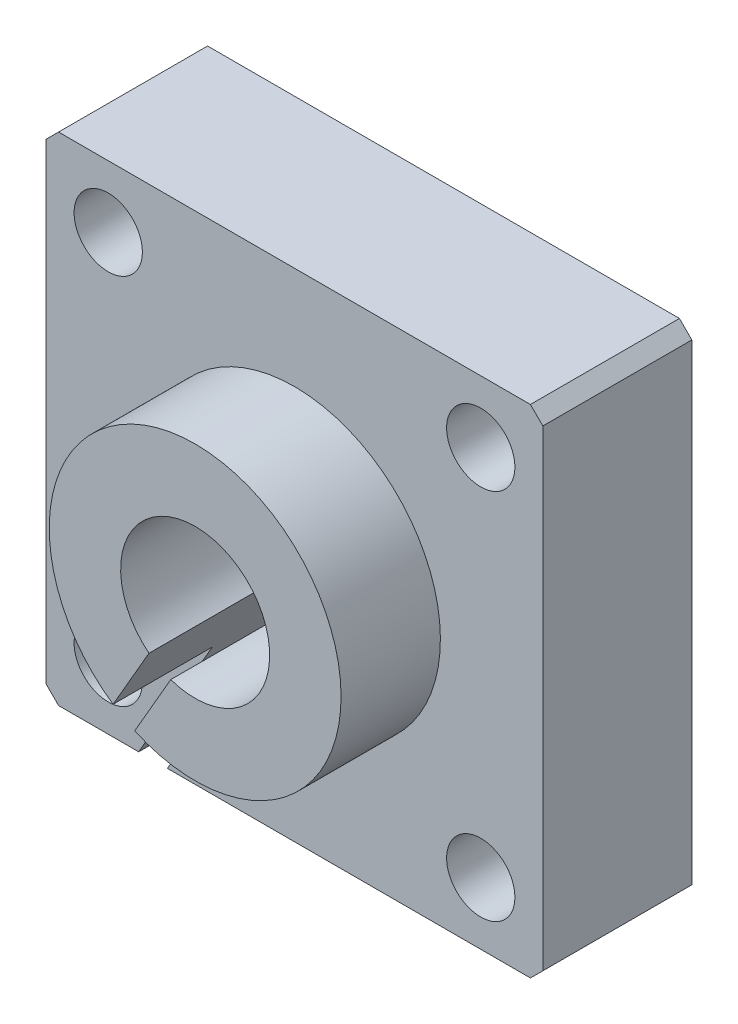
ISO-10303-21;
HEADER;
FILE_DESCRIPTION(('STEP AP214'),'2;1');
FILE_NAME('part.step','',(''),(''),'','','');
FILE_SCHEMA(('AUTOMOTIVE_DESIGN { 1 0 10303 214 1 1 1 1 }'));
ENDSEC;
DATA;
#1=APPLICATION_CONTEXT('core data for automotive mechanical design processes');
#2=APPLICATION_PROTOCOL_DEFINITION('international standard','automotive_design',2000,#1);
#3=PRODUCT_CONTEXT('',#1,'mechanical');
#4=PRODUCT('Part','Part','',(#3));
#5=PRODUCT_RELATED_PRODUCT_CATEGORY('part','',(#4));
#6=PRODUCT_DEFINITION_FORMATION('','',#4);
#7=PRODUCT_DEFINITION_CONTEXT('part definition',#1,'design');
#8=PRODUCT_DEFINITION('design','',#6,#7);
#9=PRODUCT_DEFINITION_SHAPE('','',#8);
#10=(LENGTH_UNIT() NAMED_UNIT(*) SI_UNIT(.MILLI.,.METRE.));
#11=(NAMED_UNIT(*) PLANE_ANGLE_UNIT() SI_UNIT($,.RADIAN.));
#12=(NAMED_UNIT(*) SI_UNIT($,.STERADIAN.) SOLID_ANGLE_UNIT());
#13=UNCERTAINTY_MEASURE_WITH_UNIT(LENGTH_MEASURE(1.E-05),#10,'distance_accuracy_value','');
#14=(GEOMETRIC_REPRESENTATION_CONTEXT(3) GLOBAL_UNCERTAINTY_ASSIGNED_CONTEXT((#13)) GLOBAL_UNIT_ASSIGNED_CONTEXT((#10,
#11,#12)) REPRESENTATION_CONTEXT('',''));
#15=CARTESIAN_POINT('',(0.,0.,0.));
#16=DIRECTION('',(0.,0.,1.));
#17=DIRECTION('',(1.,0.,0.));
#18=AXIS2_PLACEMENT_3D('',#15,#16,#17);
#19=CARTESIAN_POINT('',(8.1243556529579,3.80000000001399,6.));
#20=DIRECTION('',(-0.866025403784439,0.5,0.));
#21=DIRECTION('',(-0.5,-0.866025403784439,0.));
#22=AXIS2_PLACEMENT_3D('',#19,#20,#21);
#23=CONICAL_SURFACE('',#22,1.65000000004848,1.04719755118706);
#24=CARTESIAN_POINT('',(8.94935565292792,3.32368602785493,6.));
#25=VERTEX_POINT('',#24);
#26=VERTEX_LOOP('',#25);
#27=FACE_BOUND('',#26,.T.);
#28=CARTESIAN_POINT('',(8.12435565298214,3.8,6.));
#29=DIRECTION('',(0.866025403784439,-0.5,0.));
#30=DIRECTION('',(0.5,0.866025403784439,0.));
#31=AXIS2_PLACEMENT_3D('',#28,#29,#30);
#32=CIRCLE('',#31,1.65);
#33=CARTESIAN_POINT('',(8.94935565298214,5.22894191624432,6.));
#34=VERTEX_POINT('',#33);
#35=EDGE_CURVE('E190',#34,#34,#32,.F.);
#36=ORIENTED_EDGE('',*,*,#35,.T.);
#37=EDGE_LOOP('',(#36));
#38=FACE_BOUND('',#37,.T.);
#39=ADVANCED_FACE('F15',(#27,#38),#23,.F.);
#40=CARTESIAN_POINT('',(6.39230484541326,4.8,6.));
#41=DIRECTION('',(0.866025403784439,-0.5,0.));
#42=DIRECTION('',(0.5,0.866025403784439,0.));
#43=AXIS2_PLACEMENT_3D('',#40,#41,#42);
#44=CYLINDRICAL_SURFACE('',#43,1.65);
#45=CARTESIAN_POINT('',(4.66025403784439,5.8,6.));
#46=DIRECTION('',(0.866025403784439,-0.5,0.));
#47=DIRECTION('',(0.5,0.866025403784439,0.));
#48=AXIS2_PLACEMENT_3D('',#45,#46,#47);
#49=CIRCLE('',#48,1.65);
#50=CARTESIAN_POINT('',(5.48525403784439,7.22894191624432,6.));
#51=VERTEX_POINT('',#50);
#52=EDGE_CURVE('E18',#51,#51,#49,.T.);
#53=ORIENTED_EDGE('',*,*,#52,.F.);
#54=EDGE_LOOP('',(#53));
#55=FACE_BOUND('',#54,.T.);
#56=ORIENTED_EDGE('',*,*,#35,.F.);
#57=EDGE_LOOP('',(#56));
#58=FACE_BOUND('',#57,.T.);
#59=ADVANCED_FACE('F241',(#55,#58),#44,.F.);
#60=CARTESIAN_POINT('',(5.57150403784439,7.37833129839714,6.));
#61=DIRECTION('',(0.866025403784439,-0.5,0.));
#62=DIRECTION('',(0.5,0.866025403784439,0.));
#63=AXIS2_PLACEMENT_3D('',#60,#61,#62);
#64=PLANE('',#63);
#65=CARTESIAN_POINT('',(4.66025403784439,5.8,6.));
#66=DIRECTION('',(0.866025403784439,-0.5,0.));
#67=DIRECTION('',(0.5,0.866025403784439,0.));
#68=AXIS2_PLACEMENT_3D('',#65,#66,#67);
#69=CIRCLE('',#68,1.645);
#70=CARTESIAN_POINT('',(5.48275403784439,7.2246117892254,6.));
#71=VERTEX_POINT('',#70);
#72=EDGE_CURVE('E189',#71,#71,#69,.F.);
#73=ORIENTED_EDGE('',*,*,#72,.T.);
#74=EDGE_LOOP('',(#73));
#75=FACE_BOUND('',#74,.T.);
#76=ORIENTED_EDGE('',*,*,#52,.T.);
#77=EDGE_LOOP('',(#76));
#78=FACE_BOUND('',#77,.T.);
#79=ADVANCED_FACE('F239',(#75,#78),#64,.T.);
#80=CARTESIAN_POINT('',(0.483846528093932,8.21125,6.));
#81=DIRECTION('',(0.866025403784439,-0.5,0.));
#82=DIRECTION('',(0.5,0.866025403784439,0.));
#83=AXIS2_PLACEMENT_3D('',#80,#81,#82);
#84=CYLINDRICAL_SURFACE('',#83,1.645);
#85=CARTESIAN_POINT('',(-3.6925609816777,10.6225000000122,6.));
#86=DIRECTION('',(-0.866025403784439,0.5,0.));
#87=DIRECTION('',(0.499999999999999,0.866025403784439,0.));
#88=AXIS2_PLACEMENT_3D('',#85,#86,#87);
#89=CIRCLE('',#88,1.64500000005608);
#90=CARTESIAN_POINT('',(-2.87006098164966,12.0471117892862,6.));
#91=VERTEX_POINT('',#90);
#92=EDGE_CURVE('E185',#91,#91,#89,.T.);
#93=ORIENTED_EDGE('',*,*,#92,.T.);
#94=EDGE_LOOP('',(#93));
#95=FACE_BOUND('',#94,.T.);
#96=ORIENTED_EDGE('',*,*,#72,.F.);
#97=EDGE_LOOP('',(#96));
#98=FACE_BOUND('',#97,.T.);
#99=ADVANCED_FACE('F353',(#95,#98),#84,.F.);
#100=CARTESIAN_POINT('',(-3.99999999994779,10.7999999999699,6.));
#101=DIRECTION('',(-0.866025403784439,0.5,0.));
#102=DIRECTION('',(-0.5,-0.866025403784439,0.));
#103=AXIS2_PLACEMENT_3D('',#100,#101,#102);
#104=CONICAL_SURFACE('',#103,1.99999999998062,0.785398163410516);
#105=CARTESIAN_POINT('',(-3.99999999990604,10.7999999999458,6.));
#106=DIRECTION('',(-0.866025403784439,0.5,0.));
#107=DIRECTION('',(-0.5,-0.866025403784439,0.));
#108=AXIS2_PLACEMENT_3D('',#105,#106,#107);
#109=CIRCLE('',#108,1.99999999993242);
#110=CARTESIAN_POINT('',(-4.99999999987225,9.0679491924354,6.));
#111=VERTEX_POINT('',#110);
#112=EDGE_CURVE('E188',#111,#111,#109,.T.);
#113=ORIENTED_EDGE('',*,*,#112,.T.);
#114=EDGE_LOOP('',(#113));
#115=FACE_BOUND('',#114,.T.);
#116=ORIENTED_EDGE('',*,*,#92,.F.);
#117=EDGE_LOOP('',(#116));
#118=FACE_BOUND('',#117,.T.);
#119=ADVANCED_FACE('F349',(#115,#118),#104,.F.);
#120=CARTESIAN_POINT('',(-3.4375,11.7742785792575,6.));
#121=DIRECTION('',(0.866025403784439,-0.5,0.));
#122=DIRECTION('',(0.5,0.866025403784439,0.));
#123=AXIS2_PLACEMENT_3D('',#120,#121,#122);
#124=PLANE('',#123);
#125=CARTESIAN_POINT('',(-4.,10.8,6.));
#126=DIRECTION('',(-0.866025403784439,0.5,0.));
#127=DIRECTION('',(-0.5,-0.866025403784439,0.));
#128=AXIS2_PLACEMENT_3D('',#125,#126,#127);
#129=CIRCLE('',#128,2.25);
#130=CARTESIAN_POINT('',(-5.125,8.85144284148501,6.));
#131=VERTEX_POINT('',#130);
#132=EDGE_CURVE('E149',#131,#131,#129,.T.);
#133=ORIENTED_EDGE('',*,*,#132,.T.);
#134=EDGE_LOOP('',(#133));
#135=FACE_BOUND('',#134,.T.);
#136=ORIENTED_EDGE('',*,*,#112,.F.);
#137=EDGE_LOOP('',(#136));
#138=FACE_BOUND('',#137,.T.);
#139=ADVANCED_FACE('F345',(#135,#138),#124,.F.);
#140=CARTESIAN_POINT('',(-11.9637794416288,19.0063293868264,6.));
#141=DIRECTION('',(0.866025403784439,-0.5,0.));
#142=DIRECTION('',(0.5,0.866025403784439,0.));
#143=AXIS2_PLACEMENT_3D('',#140,#141,#142);
#144=PLANE('',#143);
#145=CARTESIAN_POINT('',(-13.5262794416288,16.3,6.));
#146=DIRECTION('',(-0.866025403784439,0.5,0.));
#147=DIRECTION('',(-0.5,-0.866025403784439,0.));
#148=AXIS2_PLACEMENT_3D('',#145,#146,#147);
#149=CIRCLE('',#148,4.);
#150=CARTESIAN_POINT('',(-15.5262794416288,12.8358983848622,6.));
#151=VERTEX_POINT('',#150);
#152=EDGE_CURVE('E142',#151,#151,#149,.T.);
#153=ORIENTED_EDGE('',*,*,#152,.T.);
#154=EDGE_LOOP('',(#153));
#155=FACE_BOUND('',#154,.T.);
#156=CARTESIAN_POINT('',(-13.5262794416288,16.3,6.));
#157=DIRECTION('',(-0.866025403784439,0.5,0.));
#158=DIRECTION('',(-0.5,-0.866025403784439,0.));
#159=AXIS2_PLACEMENT_3D('',#156,#157,#158);
#160=CIRCLE('',#159,2.25);
#161=CARTESIAN_POINT('',(-14.6512794416288,14.351442841485,6.));
#162=VERTEX_POINT('',#161);
#163=EDGE_CURVE('E109',#162,#162,#160,.F.);
#164=ORIENTED_EDGE('',*,*,#163,.T.);
#165=EDGE_LOOP('',(#164));
#166=FACE_BOUND('',#165,.T.);
#167=ADVANCED_FACE('F341',(#155,#166),#144,.F.);
#168=CARTESIAN_POINT('',(-8.76313972081442,13.55,6.));
#169=DIRECTION('',(-0.866025403784439,0.5,0.));
#170=DIRECTION('',(-0.5,-0.866025403784439,0.));
#171=AXIS2_PLACEMENT_3D('',#168,#169,#170);
#172=CYLINDRICAL_SURFACE('',#171,2.25);
#173=ORIENTED_EDGE('',*,*,#132,.F.);
#174=EDGE_LOOP('',(#173));
#175=FACE_BOUND('',#174,.T.);
#176=CARTESIAN_POINT('',(-4.00166604983953,10.8009618943233,6.));
#177=DIRECTION('',(-0.866025403784439,0.5,0.));
#178=DIRECTION('',(-0.5,-0.866025403784439,0.));
#179=AXIS2_PLACEMENT_3D('',#176,#177,#178);
#180=CIRCLE('',#179,2.25);
#181=CARTESIAN_POINT('',(-5.12666604983953,8.85240473580834,6.));
#182=VERTEX_POINT('',#181);
#183=EDGE_CURVE('E154',#182,#182,#180,.F.);
#184=ORIENTED_EDGE('',*,*,#183,.F.);
#185=EDGE_LOOP('',(#184));
#186=FACE_BOUND('',#185,.T.);
#187=ADVANCED_FACE('F337',(#175,#186),#172,.F.);
#188=CARTESIAN_POINT('',(20.,1.,0.));
#189=DIRECTION('',(0.707106781186548,-0.707106781186548,0.));
#190=DIRECTION('',(0.707106781186548,0.707106781186548,0.));
#191=AXIS2_PLACEMENT_3D('',#188,#189,#190);
#192=PLANE('',#191);
#193=DIRECTION('',(0.707106781186548,0.707106781186548,0.));
#194=VECTOR('',#193,1.);
#195=CARTESIAN_POINT('',(20.,1.,0.));
#196=LINE('',#195,#194);
#197=CARTESIAN_POINT('',(19.,0.,0.));
#198=VERTEX_POINT('',#197);
#199=CARTESIAN_POINT('',(20.,1.,0.));
#200=VERTEX_POINT('',#199);
#201=EDGE_CURVE('E146',#198,#200,#196,.T.);
#202=ORIENTED_EDGE('',*,*,#201,.T.);
#203=DIRECTION('',(0.,0.,-1.));
#204=VECTOR('',#203,1.);
#205=CARTESIAN_POINT('',(20.,1.,0.));
#206=LINE('',#205,#204);
#207=CARTESIAN_POINT('',(20.,1.,12.));
#208=VERTEX_POINT('',#207);
#209=EDGE_CURVE('E659',#208,#200,#206,.T.);
#210=ORIENTED_EDGE('',*,*,#209,.F.);
#211=DIRECTION('',(0.707106781186547,0.707106781186547,0.));
#212=VECTOR('',#211,1.);
#213=CARTESIAN_POINT('',(19.,0.,12.));
#214=LINE('',#213,#212);
#215=CARTESIAN_POINT('',(19.,0.,12.));
#216=VERTEX_POINT('',#215);
#217=EDGE_CURVE('E117',#216,#208,#214,.T.);
#218=ORIENTED_EDGE('',*,*,#217,.F.);
#219=DIRECTION('',(0.,0.,-1.));
#220=VECTOR('',#219,1.);
#221=CARTESIAN_POINT('',(19.,0.,0.));
#222=LINE('',#221,#220);
#223=EDGE_CURVE('E161',#198,#216,#222,.F.);
#224=ORIENTED_EDGE('',*,*,#223,.F.);
#225=EDGE_LOOP('',(#202,#210,#218,#224));
#226=FACE_BOUND('',#225,.T.);
#227=ADVANCED_FACE('F333',(#226),#192,.T.);
#228=CARTESIAN_POINT('',(19.,40.,0.));
#229=DIRECTION('',(0.707106781186548,0.707106781186548,0.));
#230=DIRECTION('',(-0.707106781186548,0.707106781186548,0.));
#231=AXIS2_PLACEMENT_3D('',#228,#229,#230);
#232=PLANE('',#231);
#233=DIRECTION('',(-0.707106781186548,0.707106781186548,0.));
#234=VECTOR('',#233,1.);
#235=CARTESIAN_POINT('',(19.,40.,0.));
#236=LINE('',#235,#234);
#237=CARTESIAN_POINT('',(20.,39.,0.));
#238=VERTEX_POINT('',#237);
#239=CARTESIAN_POINT('',(19.,40.,0.));
#240=VERTEX_POINT('',#239);
#241=EDGE_CURVE('E143',#238,#240,#236,.T.);
#242=ORIENTED_EDGE('',*,*,#241,.T.);
#243=DIRECTION('',(0.,0.,1.));
#244=VECTOR('',#243,1.);
#245=CARTESIAN_POINT('',(19.,40.,0.));
#246=LINE('',#245,#244);
#247=CARTESIAN_POINT('',(19.,40.,12.));
#248=VERTEX_POINT('',#247);
#249=EDGE_CURVE('E705',#248,#240,#246,.F.);
#250=ORIENTED_EDGE('',*,*,#249,.F.);
#251=DIRECTION('',(-0.707106781186547,0.707106781186547,0.));
#252=VECTOR('',#251,1.);
#253=CARTESIAN_POINT('',(20.,39.,12.));
#254=LINE('',#253,#252);
#255=CARTESIAN_POINT('',(20.,39.,12.));
#256=VERTEX_POINT('',#255);
#257=EDGE_CURVE('E723',#256,#248,#254,.T.);
#258=ORIENTED_EDGE('',*,*,#257,.F.);
#259=DIRECTION('',(0.,0.,-1.));
#260=VECTOR('',#259,1.);
#261=CARTESIAN_POINT('',(20.,39.,0.));
#262=LINE('',#261,#260);
#263=EDGE_CURVE('E672',#238,#256,#262,.F.);
#264=ORIENTED_EDGE('',*,*,#263,.F.);
#265=EDGE_LOOP('',(#242,#250,#258,#264));
#266=FACE_BOUND('',#265,.T.);
#267=ADVANCED_FACE('F329',(#266),#232,.T.);
#268=CARTESIAN_POINT('',(-18.7224318643355,19.3,6.));
#269=DIRECTION('',(-0.866025403784439,0.5,0.));
#270=DIRECTION('',(-0.5,-0.866025403784439,0.));
#271=AXIS2_PLACEMENT_3D('',#268,#269,#270);
#272=CYLINDRICAL_SURFACE('',#271,4.);
#273=ORIENTED_EDGE('',*,*,#152,.F.);
#274=EDGE_LOOP('',(#273));
#275=FACE_BOUND('',#274,.T.);
#276=CARTESIAN_POINT('',(-20.,20.037604307034,6.));
#277=DIRECTION('',(-1.,0.,0.));
#278=DIRECTION('',(0.,1.,0.));
#279=AXIS2_PLACEMENT_3D('',#276,#277,#278);
#280=ELLIPSE('',#279,4.61880215351701,4.);
#281=CARTESIAN_POINT('',(-20.,24.656406460551,6.));
#282=VERTEX_POINT('',#281);
#283=EDGE_CURVE('E175',#282,#282,#280,.F.);
#284=ORIENTED_EDGE('',*,*,#283,.F.);
#285=EDGE_LOOP('',(#284));
#286=FACE_BOUND('',#285,.T.);
#287=ADVANCED_FACE('F325',(#275,#286),#272,.F.);
#288=CARTESIAN_POINT('',(-20.,39.,0.));
#289=DIRECTION('',(-0.707106781186548,0.707106781186548,0.));
#290=DIRECTION('',(-0.707106781186548,-0.707106781186548,0.));
#291=AXIS2_PLACEMENT_3D('',#288,#289,#290);
#292=PLANE('',#291);
#293=DIRECTION('',(-0.707106781186548,-0.707106781186548,0.));
#294=VECTOR('',#293,1.);
#295=CARTESIAN_POINT('',(-20.,39.,0.));
#296=LINE('',#295,#294);
#297=CARTESIAN_POINT('',(-19.,40.,0.));
#298=VERTEX_POINT('',#297);
#299=CARTESIAN_POINT('',(-20.,39.,0.));
#300=VERTEX_POINT('',#299);
#301=EDGE_CURVE('E131',#298,#300,#296,.T.);
#302=ORIENTED_EDGE('',*,*,#301,.T.);
#303=DIRECTION('',(0.,0.,1.));
#304=VECTOR('',#303,1.);
#305=CARTESIAN_POINT('',(-20.,39.,0.));
#306=LINE('',#305,#304);
#307=CARTESIAN_POINT('',(-20.,39.,12.));
#308=VERTEX_POINT('',#307);
#309=EDGE_CURVE('E169',#308,#300,#306,.F.);
#310=ORIENTED_EDGE('',*,*,#309,.F.);
#311=DIRECTION('',(-0.707106781186547,-0.707106781186547,0.));
#312=VECTOR('',#311,1.);
#313=CARTESIAN_POINT('',(-19.,40.,12.));
#314=LINE('',#313,#312);
#315=CARTESIAN_POINT('',(-19.,40.,12.));
#316=VERTEX_POINT('',#315);
#317=EDGE_CURVE('E137',#316,#308,#314,.T.);
#318=ORIENTED_EDGE('',*,*,#317,.F.);
#319=DIRECTION('',(0.,0.,1.));
#320=VECTOR('',#319,1.);
#321=CARTESIAN_POINT('',(-19.,40.,0.));
#322=LINE('',#321,#320);
#323=EDGE_CURVE('E221',#298,#316,#322,.T.);
#324=ORIENTED_EDGE('',*,*,#323,.F.);
#325=EDGE_LOOP('',(#302,#310,#318,#324));
#326=FACE_BOUND('',#325,.T.);
#327=ADVANCED_FACE('F321',(#326),#292,.T.);
#328=CARTESIAN_POINT('',(-19.,0.,0.));
#329=DIRECTION('',(-0.707106781186548,-0.707106781186548,0.));
#330=DIRECTION('',(0.707106781186548,-0.707106781186548,0.));
#331=AXIS2_PLACEMENT_3D('',#328,#329,#330);
#332=PLANE('',#331);
#333=DIRECTION('',(0.707106781186548,-0.707106781186548,0.));
#334=VECTOR('',#333,1.);
#335=CARTESIAN_POINT('',(-19.,0.,0.));
#336=LINE('',#335,#334);
#337=CARTESIAN_POINT('',(-20.,1.,0.));
#338=VERTEX_POINT('',#337);
#339=CARTESIAN_POINT('',(-19.,0.,0.));
#340=VERTEX_POINT('',#339);
#341=EDGE_CURVE('E129',#338,#340,#336,.T.);
#342=ORIENTED_EDGE('',*,*,#341,.T.);
#343=DIRECTION('',(0.,0.,-1.));
#344=VECTOR('',#343,1.);
#345=CARTESIAN_POINT('',(-19.,0.,0.));
#346=LINE('',#345,#344);
#347=CARTESIAN_POINT('',(-19.,0.,12.));
#348=VERTEX_POINT('',#347);
#349=EDGE_CURVE('E125',#348,#340,#346,.T.);
#350=ORIENTED_EDGE('',*,*,#349,.F.);
#351=DIRECTION('',(0.707106781186547,-0.707106781186547,0.));
#352=VECTOR('',#351,1.);
#353=CARTESIAN_POINT('',(-20.,1.,12.));
#354=LINE('',#353,#352);
#355=CARTESIAN_POINT('',(-20.,0.999999999999997,12.));
#356=VERTEX_POINT('',#355);
#357=EDGE_CURVE('E134',#356,#348,#354,.T.);
#358=ORIENTED_EDGE('',*,*,#357,.F.);
#359=DIRECTION('',(0.,0.,1.));
#360=VECTOR('',#359,1.);
#361=CARTESIAN_POINT('',(-20.,1.,0.));
#362=LINE('',#361,#360);
#363=EDGE_CURVE('E126',#338,#356,#362,.T.);
#364=ORIENTED_EDGE('',*,*,#363,.F.);
#365=EDGE_LOOP('',(#342,#350,#358,#364));
#366=FACE_BOUND('',#365,.T.);
#367=ADVANCED_FACE('F317',(#366),#332,.T.);
#368=CARTESIAN_POINT('',(-8.76313972081442,13.55,6.));
#369=DIRECTION('',(-0.866025403784439,0.5,0.));
#370=DIRECTION('',(-0.5,-0.866025403784439,0.));
#371=AXIS2_PLACEMENT_3D('',#368,#369,#370);
#372=CYLINDRICAL_SURFACE('',#371,2.25);
#373=ORIENTED_EDGE('',*,*,#163,.F.);
#374=EDGE_LOOP('',(#373));
#375=FACE_BOUND('',#374,.T.);
#376=CARTESIAN_POINT('',(-5.7337168574084,11.8009618943233,6.));
#377=DIRECTION('',(-0.866025403784439,0.5,0.));
#378=DIRECTION('',(-0.5,-0.866025403784439,0.));
#379=AXIS2_PLACEMENT_3D('',#376,#377,#378);
#380=CIRCLE('',#379,2.25);
#381=CARTESIAN_POINT('',(-6.85871685740841,9.85240473580835,6.));
#382=VERTEX_POINT('',#381);
#383=EDGE_CURVE('E216',#382,#382,#380,.T.);
#384=ORIENTED_EDGE('',*,*,#383,.F.);
#385=EDGE_LOOP('',(#384));
#386=FACE_BOUND('',#385,.T.);
#387=ADVANCED_FACE('F314',(#375,#386),#372,.F.);
#388=CARTESIAN_POINT('',(0.,20.,20.));
#389=DIRECTION('',(0.,0.,1.));
#390=DIRECTION('',(1.,0.,0.));
#391=AXIS2_PLACEMENT_3D('',#388,#389,#390);
#392=PLANE('',#391);
#393=DIRECTION('',(-0.5,-0.866025403784439,0.));
#394=VECTOR('',#393,1.);
#395=CARTESIAN_POINT('',(-9.26794919243113,1.67949192431123,20.));
#396=LINE('',#395,#394);
#397=CARTESIAN_POINT('',(-4.86552564800522,9.30471317969437,20.));
#398=VERTEX_POINT('',#397);
#399=CARTESIAN_POINT('',(-1.96388289904852,14.3305058463012,20.));
#400=VERTEX_POINT('',#399);
#401=EDGE_CURVE('E104',#398,#400,#396,.F.);
#402=ORIENTED_EDGE('',*,*,#401,.F.);
#403=CARTESIAN_POINT('',(0.,20.,20.));
#404=DIRECTION('',(0.,0.,-1.));
#405=DIRECTION('',(-1.,0.,0.));
#406=AXIS2_PLACEMENT_3D('',#403,#404,#405);
#407=CIRCLE('',#406,11.75);
#408=CARTESIAN_POINT('',(-6.60902082262899,10.2848909544948,20.));
#409=VERTEX_POINT('',#408);
#410=EDGE_CURVE('E102',#409,#398,#407,.T.);
#411=ORIENTED_EDGE('',*,*,#410,.F.);
#412=DIRECTION('',(0.5,0.866025403784439,0.));
#413=VECTOR('',#412,1.);
#414=CARTESIAN_POINT('',(-11.,2.67949192431123,20.));
#415=LINE('',#414,#413);
#416=CARTESIAN_POINT('',(-3.71858552175949,15.2912717515914,20.));
#417=VERTEX_POINT('',#416);
#418=EDGE_CURVE('E88',#417,#409,#415,.F.);
#419=ORIENTED_EDGE('',*,*,#418,.F.);
#420=CARTESIAN_POINT('',(0.,20.,20.));
#421=DIRECTION('',(0.,0.,1.));
#422=DIRECTION('',(1.,0.,0.));
#423=AXIS2_PLACEMENT_3D('',#420,#421,#422);
#424=CIRCLE('',#423,6.);
#425=EDGE_CURVE('E136',#417,#400,#424,.F.);
#426=ORIENTED_EDGE('',*,*,#425,.T.);
#427=EDGE_LOOP('',(#402,#411,#419,#426));
#428=FACE_BOUND('',#427,.T.);
#429=ADVANCED_FACE('F103',(#428),#392,.T.);
#430=CARTESIAN_POINT('',(0.,20.,16.));
#431=DIRECTION('',(0.,0.,-1.));
#432=DIRECTION('',(-1.,0.,0.));
#433=AXIS2_PLACEMENT_3D('',#430,#431,#432);
#434=CYLINDRICAL_SURFACE('',#433,11.75);
#435=DIRECTION('',(0.,0.,1.));
#436=VECTOR('',#435,1.);
#437=CARTESIAN_POINT('',(-6.60902082262899,10.2848909544948,10.));
#438=LINE('',#437,#436);
#439=CARTESIAN_POINT('',(-6.60902082262899,10.2848909544948,12.));
#440=VERTEX_POINT('',#439);
#441=EDGE_CURVE('E93',#409,#440,#438,.F.);
#442=ORIENTED_EDGE('',*,*,#441,.F.);
#443=ORIENTED_EDGE('',*,*,#410,.T.);
#444=DIRECTION('',(0.,0.,1.));
#445=VECTOR('',#444,1.);
#446=CARTESIAN_POINT('',(-4.86552564800522,9.30471317969436,10.));
#447=LINE('',#446,#445);
#448=CARTESIAN_POINT('',(-4.86552564800522,9.30471317969436,12.));
#449=VERTEX_POINT('',#448);
#450=EDGE_CURVE('E153',#449,#398,#447,.T.);
#451=ORIENTED_EDGE('',*,*,#450,.F.);
#452=CARTESIAN_POINT('',(0.,20.,12.));
#453=DIRECTION('',(0.,0.,-1.));
#454=DIRECTION('',(-1.,0.,0.));
#455=AXIS2_PLACEMENT_3D('',#452,#453,#454);
#456=CIRCLE('',#455,11.75);
#457=EDGE_CURVE('E108',#440,#449,#456,.T.);
#458=ORIENTED_EDGE('',*,*,#457,.F.);
#459=EDGE_LOOP('',(#442,#443,#451,#458));
#460=FACE_BOUND('',#459,.T.);
#461=ADVANCED_FACE('F111',(#460),#434,.T.);
#462=CARTESIAN_POINT('',(0.,20.,12.));
#463=DIRECTION('',(0.,0.,1.));
#464=DIRECTION('',(1.,0.,0.));
#465=AXIS2_PLACEMENT_3D('',#462,#463,#464);
#466=PLANE('',#465);
#467=CARTESIAN_POINT('',(15.,5.,12.));
#468=DIRECTION('',(0.,0.,1.));
#469=DIRECTION('',(1.,0.,0.));
#470=AXIS2_PLACEMENT_3D('',#467,#468,#469);
#471=CIRCLE('',#470,2.75);
#472=CARTESIAN_POINT('',(17.75,5.,12.));
#473=VERTEX_POINT('',#472);
#474=EDGE_CURVE('E114',#473,#473,#471,.F.);
#475=ORIENTED_EDGE('',*,*,#474,.T.);
#476=EDGE_LOOP('',(#475));
#477=FACE_BOUND('',#476,.T.);
#478=CARTESIAN_POINT('',(15.,35.,12.));
#479=DIRECTION('',(0.,0.,1.));
#480=DIRECTION('',(1.,0.,0.));
#481=AXIS2_PLACEMENT_3D('',#478,#479,#480);
#482=CIRCLE('',#481,2.75);
#483=CARTESIAN_POINT('',(17.75,35.,12.));
#484=VERTEX_POINT('',#483);
#485=EDGE_CURVE('E211',#484,#484,#482,.F.);
#486=ORIENTED_EDGE('',*,*,#485,.T.);
#487=EDGE_LOOP('',(#486));
#488=FACE_BOUND('',#487,.T.);
#489=CARTESIAN_POINT('',(-15.,5.,12.));
#490=DIRECTION('',(0.,0.,1.));
#491=DIRECTION('',(1.,0.,0.));
#492=AXIS2_PLACEMENT_3D('',#489,#490,#491);
#493=CIRCLE('',#492,2.75);
#494=CARTESIAN_POINT('',(-12.25,5.,12.));
#495=VERTEX_POINT('',#494);
#496=EDGE_CURVE('E208',#495,#495,#493,.F.);
#497=ORIENTED_EDGE('',*,*,#496,.T.);
#498=EDGE_LOOP('',(#497));
#499=FACE_BOUND('',#498,.T.);
#500=CARTESIAN_POINT('',(-15.,35.,12.));
#501=DIRECTION('',(0.,0.,1.));
#502=DIRECTION('',(1.,0.,0.));
#503=AXIS2_PLACEMENT_3D('',#500,#501,#502);
#504=CIRCLE('',#503,2.75);
#505=CARTESIAN_POINT('',(-12.25,35.,12.));
#506=VERTEX_POINT('',#505);
#507=EDGE_CURVE('E205',#506,#506,#504,.F.);
#508=ORIENTED_EDGE('',*,*,#507,.T.);
#509=EDGE_LOOP('',(#508));
#510=FACE_BOUND('',#509,.T.);
#511=ORIENTED_EDGE('',*,*,#357,.T.);
#512=DIRECTION('',(1.,0.,0.));
#513=VECTOR('',#512,1.);
#514=CARTESIAN_POINT('',(0.,0.,12.));
#515=LINE('',#514,#513);
#516=CARTESIAN_POINT('',(-12.5470053837925,0.,12.));
#517=VERTEX_POINT('',#516);
#518=EDGE_CURVE('E122',#517,#348,#515,.F.);
#519=ORIENTED_EDGE('',*,*,#518,.F.);
#520=DIRECTION('',(0.5,0.866025403784439,0.));
#521=VECTOR('',#520,1.);
#522=CARTESIAN_POINT('',(-11.,2.67949192431123,12.));
#523=LINE('',#522,#521);
#524=EDGE_CURVE('E112',#440,#517,#523,.F.);
#525=ORIENTED_EDGE('',*,*,#524,.F.);
#526=ORIENTED_EDGE('',*,*,#457,.T.);
#527=DIRECTION('',(-0.5,-0.866025403784439,0.));
#528=VECTOR('',#527,1.);
#529=CARTESIAN_POINT('',(-9.26794919243113,1.67949192431123,12.));
#530=LINE('',#529,#528);
#531=CARTESIAN_POINT('',(-10.237604307034,0.,12.));
#532=VERTEX_POINT('',#531);
#533=EDGE_CURVE('E150',#532,#449,#530,.F.);
#534=ORIENTED_EDGE('',*,*,#533,.F.);
#535=DIRECTION('',(1.,0.,0.));
#536=VECTOR('',#535,1.);
#537=CARTESIAN_POINT('',(0.,0.,12.));
#538=LINE('',#537,#536);
#539=EDGE_CURVE('E157',#216,#532,#538,.F.);
#540=ORIENTED_EDGE('',*,*,#539,.F.);
#541=ORIENTED_EDGE('',*,*,#217,.T.);
#542=DIRECTION('',(0.,1.,0.));
#543=VECTOR('',#542,1.);
#544=CARTESIAN_POINT('',(20.,39.,12.));
#545=LINE('',#544,#543);
#546=EDGE_CURVE('E160',#256,#208,#545,.F.);
#547=ORIENTED_EDGE('',*,*,#546,.F.);
#548=ORIENTED_EDGE('',*,*,#257,.T.);
#549=DIRECTION('',(1.,0.,0.));
#550=VECTOR('',#549,1.);
#551=CARTESIAN_POINT('',(-19.,40.,12.));
#552=LINE('',#551,#550);
#553=EDGE_CURVE('E708',#316,#248,#552,.T.);
#554=ORIENTED_EDGE('',*,*,#553,.F.);
#555=ORIENTED_EDGE('',*,*,#317,.T.);
#556=DIRECTION('',(0.,1.,0.));
#557=VECTOR('',#556,1.);
#558=CARTESIAN_POINT('',(-20.,1.,12.));
#559=LINE('',#558,#557);
#560=EDGE_CURVE('E172',#356,#308,#559,.T.);
#561=ORIENTED_EDGE('',*,*,#560,.F.);
#562=EDGE_LOOP('',(#511,#519,#525,#526,#534,#540,#541,#547,#548,#554,#555,#561));
#563=FACE_BOUND('',#562,.T.);
#564=ADVANCED_FACE('F305',(#477,#488,#499,#510,#563),#466,.T.);
#565=CARTESIAN_POINT('',(0.,20.,10.));
#566=DIRECTION('',(0.,0.,1.));
#567=DIRECTION('',(1.,0.,0.));
#568=AXIS2_PLACEMENT_3D('',#565,#566,#567);
#569=CYLINDRICAL_SURFACE('',#568,6.);
#570=CARTESIAN_POINT('',(0.,20.,0.));
#571=DIRECTION('',(0.,0.,1.));
#572=DIRECTION('',(1.,0.,0.));
#573=AXIS2_PLACEMENT_3D('',#570,#571,#572);
#574=CIRCLE('',#573,6.);
#575=CARTESIAN_POINT('',(-3.71858552175948,15.2912717515914,0.));
#576=VERTEX_POINT('',#575);
#577=CARTESIAN_POINT('',(-1.96388289904851,14.3305058463012,0.));
#578=VERTEX_POINT('',#577);
#579=EDGE_CURVE('E202',#576,#578,#574,.F.);
#580=ORIENTED_EDGE('',*,*,#579,.T.);
#581=DIRECTION('',(0.,0.,1.));
#582=VECTOR('',#581,1.);
#583=CARTESIAN_POINT('',(-1.96388289904852,14.3305058463012,10.));
#584=LINE('',#583,#582);
#585=EDGE_CURVE('E165',#400,#578,#584,.F.);
#586=ORIENTED_EDGE('',*,*,#585,.F.);
#587=ORIENTED_EDGE('',*,*,#425,.F.);
#588=DIRECTION('',(0.,0.,1.));
#589=VECTOR('',#588,1.);
#590=CARTESIAN_POINT('',(-3.7185855217595,15.2912717515914,10.));
#591=LINE('',#590,#589);
#592=EDGE_CURVE('E96',#576,#417,#591,.T.);
#593=ORIENTED_EDGE('',*,*,#592,.F.);
#594=EDGE_LOOP('',(#580,#586,#587,#593));
#595=FACE_BOUND('',#594,.T.);
#596=ADVANCED_FACE('F301',(#595),#569,.F.);
#597=CARTESIAN_POINT('',(-9.26794919243113,1.67949192431123,10.));
#598=DIRECTION('',(-0.866025403784439,0.5,0.));
#599=DIRECTION('',(-0.5,-0.866025403784439,0.));
#600=AXIS2_PLACEMENT_3D('',#597,#598,#599);
#601=PLANE('',#600);
#602=ORIENTED_EDGE('',*,*,#585,.T.);
#603=DIRECTION('',(-0.499999999999999,-0.866025403784439,0.));
#604=VECTOR('',#603,1.);
#605=CARTESIAN_POINT('',(-1.96388289904851,14.3305058463012,0.));
#606=LINE('',#605,#604);
#607=CARTESIAN_POINT('',(-10.237604307034,0.,0.));
#608=VERTEX_POINT('',#607);
#609=EDGE_CURVE('E204',#578,#608,#606,.T.);
#610=ORIENTED_EDGE('',*,*,#609,.T.);
#611=DIRECTION('',(0.,0.,-1.));
#612=VECTOR('',#611,1.);
#613=CARTESIAN_POINT('',(-10.237604307034,0.,0.));
#614=LINE('',#613,#612);
#615=EDGE_CURVE('E714',#532,#608,#614,.T.);
#616=ORIENTED_EDGE('',*,*,#615,.F.);
#617=ORIENTED_EDGE('',*,*,#533,.T.);
#618=ORIENTED_EDGE('',*,*,#450,.T.);
#619=ORIENTED_EDGE('',*,*,#401,.T.);
#620=EDGE_LOOP('',(#602,#610,#616,#617,#618,#619));
#621=FACE_BOUND('',#620,.T.);
#622=ORIENTED_EDGE('',*,*,#183,.T.);
#623=EDGE_LOOP('',(#622));
#624=FACE_BOUND('',#623,.T.);
#625=ADVANCED_FACE('F297',(#621,#624),#601,.T.);
#626=CARTESIAN_POINT('',(0.,0.,0.));
#627=DIRECTION('',(0.,-1.,0.));
#628=DIRECTION('',(0.,0.,-1.));
#629=AXIS2_PLACEMENT_3D('',#626,#627,#628);
#630=PLANE('',#629);
#631=ORIENTED_EDGE('',*,*,#223,.T.);
#632=ORIENTED_EDGE('',*,*,#539,.T.);
#633=ORIENTED_EDGE('',*,*,#615,.T.);
#634=DIRECTION('',(1.,0.,0.));
#635=VECTOR('',#634,1.);
#636=CARTESIAN_POINT('',(0.,0.,0.));
#637=LINE('',#636,#635);
#638=EDGE_CURVE('E678',#608,#198,#637,.T.);
#639=ORIENTED_EDGE('',*,*,#638,.T.);
#640=EDGE_LOOP('',(#631,#632,#633,#639));
#641=FACE_BOUND('',#640,.T.);
#642=ADVANCED_FACE('F293',(#641),#630,.T.);
#643=CARTESIAN_POINT('',(20.,39.,0.));
#644=DIRECTION('',(1.,0.,0.));
#645=DIRECTION('',(0.,0.,-1.));
#646=AXIS2_PLACEMENT_3D('',#643,#644,#645);
#647=PLANE('',#646);
#648=DIRECTION('',(0.,1.,0.));
#649=VECTOR('',#648,1.);
#650=CARTESIAN_POINT('',(20.,20.,0.));
#651=LINE('',#650,#649);
#652=EDGE_CURVE('E670',#200,#238,#651,.T.);
#653=ORIENTED_EDGE('',*,*,#652,.T.);
#654=ORIENTED_EDGE('',*,*,#263,.T.);
#655=ORIENTED_EDGE('',*,*,#546,.T.);
#656=ORIENTED_EDGE('',*,*,#209,.T.);
#657=EDGE_LOOP('',(#653,#654,#655,#656));
#658=FACE_BOUND('',#657,.T.);
#659=ADVANCED_FACE('F289',(#658),#647,.T.);
#660=CARTESIAN_POINT('',(-19.,40.,0.));
#661=DIRECTION('',(0.,1.,0.));
#662=DIRECTION('',(0.,0.,1.));
#663=AXIS2_PLACEMENT_3D('',#660,#661,#662);
#664=PLANE('',#663);
#665=DIRECTION('',(1.,0.,0.));
#666=VECTOR('',#665,1.);
#667=CARTESIAN_POINT('',(0.,40.,0.));
#668=LINE('',#667,#666);
#669=EDGE_CURVE('E182',#240,#298,#668,.F.);
#670=ORIENTED_EDGE('',*,*,#669,.T.);
#671=ORIENTED_EDGE('',*,*,#323,.T.);
#672=ORIENTED_EDGE('',*,*,#553,.T.);
#673=ORIENTED_EDGE('',*,*,#249,.T.);
#674=EDGE_LOOP('',(#670,#671,#672,#673));
#675=FACE_BOUND('',#674,.T.);
#676=ADVANCED_FACE('F285',(#675),#664,.T.);
#677=CARTESIAN_POINT('',(-20.,1.,0.));
#678=DIRECTION('',(-1.,0.,0.));
#679=DIRECTION('',(0.,0.,1.));
#680=AXIS2_PLACEMENT_3D('',#677,#678,#679);
#681=PLANE('',#680);
#682=DIRECTION('',(0.,1.,0.));
#683=VECTOR('',#682,1.);
#684=CARTESIAN_POINT('',(-20.,20.,0.));
#685=LINE('',#684,#683);
#686=EDGE_CURVE('E178',#300,#338,#685,.F.);
#687=ORIENTED_EDGE('',*,*,#686,.T.);
#688=ORIENTED_EDGE('',*,*,#363,.T.);
#689=ORIENTED_EDGE('',*,*,#560,.T.);
#690=ORIENTED_EDGE('',*,*,#309,.T.);
#691=EDGE_LOOP('',(#687,#688,#689,#690));
#692=FACE_BOUND('',#691,.T.);
#693=ORIENTED_EDGE('',*,*,#283,.T.);
#694=EDGE_LOOP('',(#693));
#695=FACE_BOUND('',#694,.T.);
#696=ADVANCED_FACE('F281',(#692,#695),#681,.T.);
#697=CARTESIAN_POINT('',(0.,0.,0.));
#698=DIRECTION('',(0.,-1.,0.));
#699=DIRECTION('',(0.,0.,-1.));
#700=AXIS2_PLACEMENT_3D('',#697,#698,#699);
#701=PLANE('',#700);
#702=ORIENTED_EDGE('',*,*,#349,.T.);
#703=DIRECTION('',(1.,0.,0.));
#704=VECTOR('',#703,1.);
#705=CARTESIAN_POINT('',(0.,0.,0.));
#706=LINE('',#705,#704);
#707=CARTESIAN_POINT('',(-12.5470053837925,0.,0.));
#708=VERTEX_POINT('',#707);
#709=EDGE_CURVE('E181',#340,#708,#706,.T.);
#710=ORIENTED_EDGE('',*,*,#709,.T.);
#711=DIRECTION('',(0.,0.,1.));
#712=VECTOR('',#711,1.);
#713=CARTESIAN_POINT('',(-12.5470053837925,0.,10.));
#714=LINE('',#713,#712);
#715=EDGE_CURVE('E33',#517,#708,#714,.F.);
#716=ORIENTED_EDGE('',*,*,#715,.F.);
#717=ORIENTED_EDGE('',*,*,#518,.T.);
#718=EDGE_LOOP('',(#702,#710,#716,#717));
#719=FACE_BOUND('',#718,.T.);
#720=ADVANCED_FACE('F278',(#719),#701,.T.);
#721=CARTESIAN_POINT('',(-11.,2.67949192431123,10.));
#722=DIRECTION('',(0.866025403784439,-0.5,0.));
#723=DIRECTION('',(0.5,0.866025403784439,0.));
#724=AXIS2_PLACEMENT_3D('',#721,#722,#723);
#725=PLANE('',#724);
#726=ORIENTED_EDGE('',*,*,#441,.T.);
#727=ORIENTED_EDGE('',*,*,#524,.T.);
#728=ORIENTED_EDGE('',*,*,#715,.T.);
#729=DIRECTION('',(0.5,0.866025403784438,0.));
#730=VECTOR('',#729,1.);
#731=CARTESIAN_POINT('',(-12.5470053837925,0.,0.));
#732=LINE('',#731,#730);
#733=EDGE_CURVE('E201',#708,#576,#732,.T.);
#734=ORIENTED_EDGE('',*,*,#733,.T.);
#735=ORIENTED_EDGE('',*,*,#592,.T.);
#736=ORIENTED_EDGE('',*,*,#418,.T.);
#737=EDGE_LOOP('',(#726,#727,#728,#734,#735,#736));
#738=FACE_BOUND('',#737,.T.);
#739=ORIENTED_EDGE('',*,*,#383,.T.);
#740=EDGE_LOOP('',(#739));
#741=FACE_BOUND('',#740,.T.);
#742=ADVANCED_FACE('F90',(#738,#741),#725,.T.);
#743=CARTESIAN_POINT('',(15.,5.,6.));
#744=DIRECTION('',(0.,0.,1.));
#745=DIRECTION('',(1.,0.,0.));
#746=AXIS2_PLACEMENT_3D('',#743,#744,#745);
#747=CYLINDRICAL_SURFACE('',#746,2.75);
#748=ORIENTED_EDGE('',*,*,#474,.F.);
#749=EDGE_LOOP('',(#748));
#750=FACE_BOUND('',#749,.T.);
#751=CARTESIAN_POINT('',(15.,5.,0.));
#752=DIRECTION('',(0.,0.,1.));
#753=DIRECTION('',(1.,0.,0.));
#754=AXIS2_PLACEMENT_3D('',#751,#752,#753);
#755=CIRCLE('',#754,2.75);
#756=CARTESIAN_POINT('',(17.75,5.,0.));
#757=VERTEX_POINT('',#756);
#758=EDGE_CURVE('E198',#757,#757,#755,.F.);
#759=ORIENTED_EDGE('',*,*,#758,.T.);
#760=EDGE_LOOP('',(#759));
#761=FACE_BOUND('',#760,.T.);
#762=ADVANCED_FACE('F271',(#750,#761),#747,.F.);
#763=CARTESIAN_POINT('',(15.,35.,6.));
#764=DIRECTION('',(0.,0.,1.));
#765=DIRECTION('',(1.,0.,0.));
#766=AXIS2_PLACEMENT_3D('',#763,#764,#765);
#767=CYLINDRICAL_SURFACE('',#766,2.75);
#768=ORIENTED_EDGE('',*,*,#485,.F.);
#769=EDGE_LOOP('',(#768));
#770=FACE_BOUND('',#769,.T.);
#771=CARTESIAN_POINT('',(15.,35.,0.));
#772=DIRECTION('',(0.,0.,1.));
#773=DIRECTION('',(1.,0.,0.));
#774=AXIS2_PLACEMENT_3D('',#771,#772,#773);
#775=CIRCLE('',#774,2.75);
#776=CARTESIAN_POINT('',(17.75,35.,0.));
#777=VERTEX_POINT('',#776);
#778=EDGE_CURVE('E195',#777,#777,#775,.F.);
#779=ORIENTED_EDGE('',*,*,#778,.T.);
#780=EDGE_LOOP('',(#779));
#781=FACE_BOUND('',#780,.T.);
#782=ADVANCED_FACE('F267',(#770,#781),#767,.F.);
#783=CARTESIAN_POINT('',(-15.,5.,6.));
#784=DIRECTION('',(0.,0.,1.));
#785=DIRECTION('',(1.,0.,0.));
#786=AXIS2_PLACEMENT_3D('',#783,#784,#785);
#787=CYLINDRICAL_SURFACE('',#786,2.75);
#788=ORIENTED_EDGE('',*,*,#496,.F.);
#789=EDGE_LOOP('',(#788));
#790=FACE_BOUND('',#789,.T.);
#791=CARTESIAN_POINT('',(-15.,5.,0.));
#792=DIRECTION('',(0.,0.,1.));
#793=DIRECTION('',(1.,0.,0.));
#794=AXIS2_PLACEMENT_3D('',#791,#792,#793);
#795=CIRCLE('',#794,2.75);
#796=CARTESIAN_POINT('',(-12.25,5.,0.));
#797=VERTEX_POINT('',#796);
#798=EDGE_CURVE('E24',#797,#797,#795,.F.);
#799=ORIENTED_EDGE('',*,*,#798,.T.);
#800=EDGE_LOOP('',(#799));
#801=FACE_BOUND('',#800,.T.);
#802=ADVANCED_FACE('F259',(#790,#801),#787,.F.);
#803=CARTESIAN_POINT('',(-15.,35.,6.));
#804=DIRECTION('',(0.,0.,1.));
#805=DIRECTION('',(1.,0.,0.));
#806=AXIS2_PLACEMENT_3D('',#803,#804,#805);
#807=CYLINDRICAL_SURFACE('',#806,2.75);
#808=ORIENTED_EDGE('',*,*,#507,.F.);
#809=EDGE_LOOP('',(#808));
#810=FACE_BOUND('',#809,.T.);
#811=CARTESIAN_POINT('',(-15.,35.,0.));
#812=DIRECTION('',(0.,0.,1.));
#813=DIRECTION('',(1.,0.,0.));
#814=AXIS2_PLACEMENT_3D('',#811,#812,#813);
#815=CIRCLE('',#814,2.75);
#816=CARTESIAN_POINT('',(-12.25,35.,0.));
#817=VERTEX_POINT('',#816);
#818=EDGE_CURVE('E10',#817,#817,#815,.F.);
#819=ORIENTED_EDGE('',*,*,#818,.T.);
#820=EDGE_LOOP('',(#819));
#821=FACE_BOUND('',#820,.T.);
#822=ADVANCED_FACE('F253',(#810,#821),#807,.F.);
#823=CARTESIAN_POINT('',(0.,20.,0.));
#824=DIRECTION('',(0.,0.,1.));
#825=DIRECTION('',(1.,0.,0.));
#826=AXIS2_PLACEMENT_3D('',#823,#824,#825);
#827=PLANE('',#826);
#828=ORIENTED_EDGE('',*,*,#818,.F.);
#829=EDGE_LOOP('',(#828));
#830=FACE_BOUND('',#829,.T.);
#831=ORIENTED_EDGE('',*,*,#798,.F.);
#832=EDGE_LOOP('',(#831));
#833=FACE_BOUND('',#832,.T.);
#834=ORIENTED_EDGE('',*,*,#778,.F.);
#835=EDGE_LOOP('',(#834));
#836=FACE_BOUND('',#835,.T.);
#837=ORIENTED_EDGE('',*,*,#758,.F.);
#838=EDGE_LOOP('',(#837));
#839=FACE_BOUND('',#838,.T.);
#840=ORIENTED_EDGE('',*,*,#709,.F.);
#841=ORIENTED_EDGE('',*,*,#341,.F.);
#842=ORIENTED_EDGE('',*,*,#686,.F.);
#843=ORIENTED_EDGE('',*,*,#301,.F.);
#844=ORIENTED_EDGE('',*,*,#669,.F.);
#845=ORIENTED_EDGE('',*,*,#241,.F.);
#846=ORIENTED_EDGE('',*,*,#652,.F.);
#847=ORIENTED_EDGE('',*,*,#201,.F.);
#848=ORIENTED_EDGE('',*,*,#638,.F.);
#849=ORIENTED_EDGE('',*,*,#609,.F.);
#850=ORIENTED_EDGE('',*,*,#579,.F.);
#851=ORIENTED_EDGE('',*,*,#733,.F.);
#852=EDGE_LOOP('',(#840,#841,#842,#843,#844,#845,#846,#847,#848,#849,#850,#851));
#853=FACE_BOUND('',#852,.T.);
#854=ADVANCED_FACE('F251',(#830,#833,#836,#839,#853),#827,.F.);
#855=CLOSED_SHELL('',(#39,#59,#79,#99,#119,#139,#167,#187,#227,#267,#287,#327,#367,#387,#429,
#461,#564,#596,#625,#642,#659,#676,#696,#720,#742,#762,#782,#802,#822,#854));
#856=MANIFOLD_SOLID_BREP('B1',#855);
#857=ADVANCED_BREP_SHAPE_REPRESENTATION('',(#18,#856),#14);
#858=SHAPE_DEFINITION_REPRESENTATION(#9,#857);
ENDSEC;
END-ISO-10303-21;
